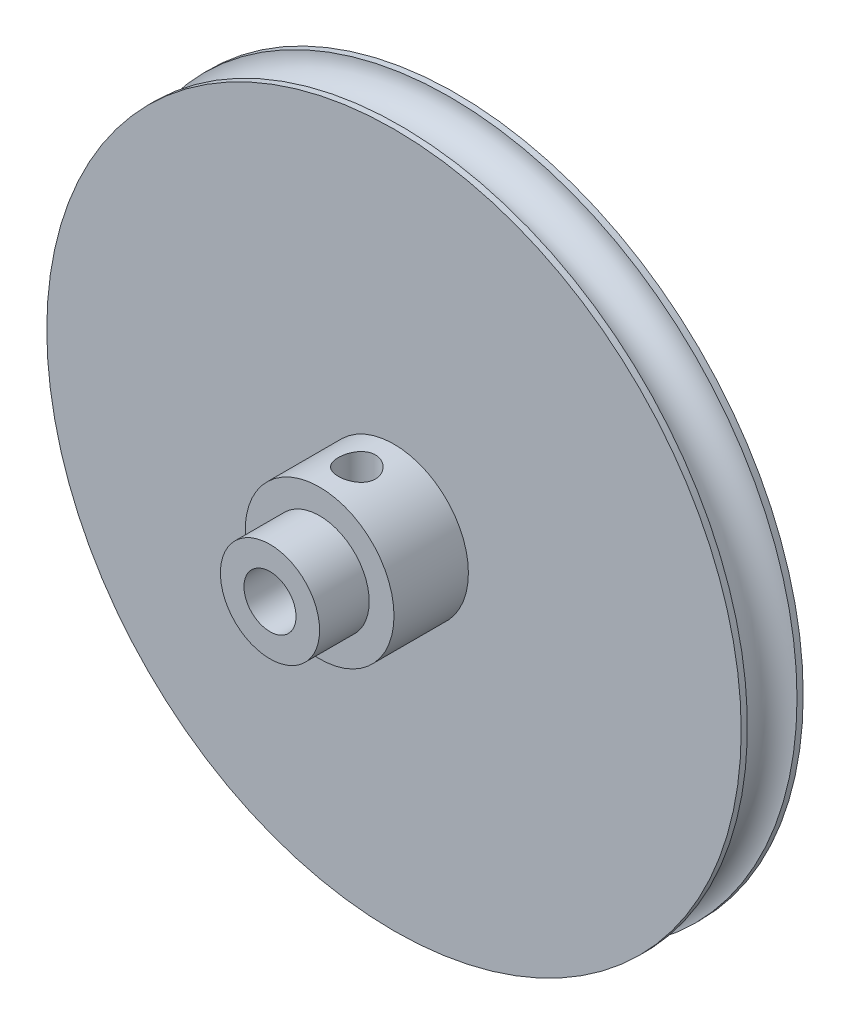
ISO-10303-21;
HEADER;
FILE_DESCRIPTION(('STEP AP214'),'2;1');
FILE_NAME('part.step','',(''),(''),'','','');
FILE_SCHEMA(('AUTOMOTIVE_DESIGN { 1 0 10303 214 1 1 1 1 }'));
ENDSEC;
DATA;
#1=APPLICATION_CONTEXT('core data for automotive mechanical design processes');
#2=APPLICATION_PROTOCOL_DEFINITION('international standard','automotive_design',2000,#1);
#3=PRODUCT_CONTEXT('',#1,'mechanical');
#4=PRODUCT('Part','Part','',(#3));
#5=PRODUCT_RELATED_PRODUCT_CATEGORY('part','',(#4));
#6=PRODUCT_DEFINITION_FORMATION('','',#4);
#7=PRODUCT_DEFINITION_CONTEXT('part definition',#1,'design');
#8=PRODUCT_DEFINITION('design','',#6,#7);
#9=PRODUCT_DEFINITION_SHAPE('','',#8);
#10=(LENGTH_UNIT() NAMED_UNIT(*) SI_UNIT(.MILLI.,.METRE.));
#11=(NAMED_UNIT(*) PLANE_ANGLE_UNIT() SI_UNIT($,.RADIAN.));
#12=(NAMED_UNIT(*) SI_UNIT($,.STERADIAN.) SOLID_ANGLE_UNIT());
#13=UNCERTAINTY_MEASURE_WITH_UNIT(LENGTH_MEASURE(1.E-05),#10,'distance_accuracy_value','');
#14=(GEOMETRIC_REPRESENTATION_CONTEXT(3) GLOBAL_UNCERTAINTY_ASSIGNED_CONTEXT((#13)) GLOBAL_UNIT_ASSIGNED_CONTEXT((#10,
#11,#12)) REPRESENTATION_CONTEXT('',''));
#15=CARTESIAN_POINT('',(0.,0.,0.));
#16=DIRECTION('',(0.,0.,1.));
#17=DIRECTION('',(1.,0.,0.));
#18=AXIS2_PLACEMENT_3D('',#15,#16,#17);
#19=CARTESIAN_POINT('',(0.,0.,0.));
#20=DIRECTION('',(0.,0.,1.));
#21=DIRECTION('',(1.,0.,0.));
#22=AXIS2_PLACEMENT_3D('',#19,#20,#21);
#23=CYLINDRICAL_SURFACE('',#22,2.1);
#24=CARTESIAN_POINT('',(0.,0.,0.));
#25=DIRECTION('',(0.,0.,1.));
#26=DIRECTION('',(1.,0.,0.));
#27=AXIS2_PLACEMENT_3D('',#24,#25,#26);
#28=CIRCLE('',#27,2.1);
#29=CARTESIAN_POINT('',(2.1,0.,0.));
#30=VERTEX_POINT('',#29);
#31=EDGE_CURVE('E72',#30,#30,#28,.T.);
#32=ORIENTED_EDGE('',*,*,#31,.F.);
#33=EDGE_LOOP('',(#32));
#34=FACE_BOUND('',#33,.T.);
#35=CARTESIAN_POINT('',(0.,0.,15.));
#36=DIRECTION('',(0.,0.,1.));
#37=DIRECTION('',(1.,0.,0.));
#38=AXIS2_PLACEMENT_3D('',#35,#36,#37);
#39=CIRCLE('',#38,2.1);
#40=CARTESIAN_POINT('',(2.1,0.,15.));
#41=VERTEX_POINT('',#40);
#42=EDGE_CURVE('E60',#41,#41,#39,.T.);
#43=ORIENTED_EDGE('',*,*,#42,.T.);
#44=EDGE_LOOP('',(#43));
#45=FACE_BOUND('',#44,.T.);
#46=CARTESIAN_POINT('',(0.,2.1,6.5));
#47=CARTESIAN_POINT('',(-0.0742399871543133,2.10000151369632,6.4999983328154));
#48=CARTESIAN_POINT('',(-0.148472287801961,2.0960305657222,6.50554237877936));
#49=CARTESIAN_POINT('',(-0.294537510569104,2.08054007579461,6.52734752510382));
#50=CARTESIAN_POINT('',(-0.366369374426851,2.06901724946753,6.54361328844457));
#51=CARTESIAN_POINT('',(-0.50528075991223,2.03953798236433,6.58580730876702));
#52=CARTESIAN_POINT('',(-0.572382093189152,2.02161374748366,6.61168722208121));
#53=CARTESIAN_POINT('',(-0.700940346431812,1.98071681938224,6.67194572495396));
#54=CARTESIAN_POINT('',(-0.762396508800773,1.95774344995381,6.70632545293122));
#55=CARTESIAN_POINT('',(-0.884158454498676,1.90604858079968,6.78590735169895));
#56=CARTESIAN_POINT('',(-0.943867292555756,1.87699641663021,6.83180339564521));
#57=CARTESIAN_POINT('',(-1.05527082397682,1.81670725523487,6.93135802863467));
#58=CARTESIAN_POINT('',(-1.10695327031243,1.78546702271467,6.98502824333768));
#59=CARTESIAN_POINT('',(-1.21060137903401,1.71725277223226,7.10994386142664));
#60=CARTESIAN_POINT('',(-1.26087106387615,1.6802808930462,7.18260623445379));
#61=CARTESIAN_POINT('',(-1.34855873776776,1.61074875287382,7.33723290190451));
#62=CARTESIAN_POINT('',(-1.38599721054951,1.57818151113002,7.41918208989052));
#63=CARTESIAN_POINT('',(-1.43652136520738,1.53205163132706,7.56383551655094));
#64=CARTESIAN_POINT('',(-1.45356662497443,1.51574445703128,7.62427010011254));
#65=CARTESIAN_POINT('',(-1.48005230154604,1.48989690052004,7.74813125986272));
#66=CARTESIAN_POINT('',(-1.48950884665266,1.48034217251357,7.81155118576373));
#67=CARTESIAN_POINT('',(-1.50020552985074,1.46950664613977,7.94023918165237));
#68=CARTESIAN_POINT('',(-1.50139229875544,1.4682795919234,8.00551653126422));
#69=CARTESIAN_POINT('',(-1.49530198035969,1.47447819447096,8.13527910247194));
#70=CARTESIAN_POINT('',(-1.48801790144054,1.48191099886764,8.19976362526865));
#71=CARTESIAN_POINT('',(-1.46411936401694,1.50554403866107,8.33404743418658));
#72=CARTESIAN_POINT('',(-1.44643072329694,1.52274402363615,8.40347164030273));
#73=CARTESIAN_POINT('',(-1.4021917385744,1.56357256020827,8.53745883716731));
#74=CARTESIAN_POINT('',(-1.37562175610307,1.58721533654268,8.60201066286822));
#75=CARTESIAN_POINT('',(-1.30511742817236,1.64601588118791,8.74487359971785));
#76=CARTESIAN_POINT('',(-1.25835357558366,1.68247147274397,8.82124871944658));
#77=CARTESIAN_POINT('',(-1.15248477752396,1.7566939000375,8.96420876920869));
#78=CARTESIAN_POINT('',(-1.09336770173586,1.79446199397487,9.03078396580656));
#79=CARTESIAN_POINT('',(-0.962800834327988,1.86780118446223,9.15374610256342));
#80=CARTESIAN_POINT('',(-0.891235370375022,1.90334699446249,9.21002630038693));
#81=CARTESIAN_POINT('',(-0.737122627440592,1.96814501690765,9.30958684669262));
#82=CARTESIAN_POINT('',(-0.65460111567732,1.99741158728469,9.35289694404326));
#83=CARTESIAN_POINT('',(-0.502786762492051,2.04003552659874,9.41495911411483));
#84=CARTESIAN_POINT('',(-0.435502933372758,2.05554723038274,9.43715862830042));
#85=CARTESIAN_POINT('',(-0.297347607907103,2.08002166700399,9.47195293731333));
#86=CARTESIAN_POINT('',(-0.226478758682595,2.08898915863501,9.48455471167792));
#87=CARTESIAN_POINT('',(-0.0828808130577211,2.09960209594909,9.49945210799232));
#88=CARTESIAN_POINT('',(-0.010146545777712,2.10122431355105,9.5017150354395));
#89=CARTESIAN_POINT('',(0.134662144507586,2.09692955045279,9.49569982836806));
#90=CARTESIAN_POINT('',(0.206736496598428,2.09101176886314,9.48742057407193));
#91=CARTESIAN_POINT('',(0.344652982451688,2.07263811534357,9.46147425615718));
#92=CARTESIAN_POINT('',(0.410628443822306,2.06050712104557,9.44427317826975));
#93=CARTESIAN_POINT('',(0.538540725972052,2.03083469907945,9.40161471286659));
#94=CARTESIAN_POINT('',(0.600476724637227,2.01329217419011,9.37615565093967));
#95=CARTESIAN_POINT('',(0.724729922862119,1.97216386451729,9.31528707061168));
#96=CARTESIAN_POINT('',(0.786570692260156,1.94817387755705,9.27918375398114));
#97=CARTESIAN_POINT('',(0.903575664869076,1.89674553679489,9.19940562360568));
#98=CARTESIAN_POINT('',(0.958734635088284,1.86930451408402,9.15572493976613));
#99=CARTESIAN_POINT('',(1.07130953790489,1.80751918651238,9.05313947500197));
#100=CARTESIAN_POINT('',(1.12732700599567,1.7728243678149,8.99291015245525));
#101=CARTESIAN_POINT('',(1.22898063188699,1.7039290476612,8.86391895127193));
#102=CARTESIAN_POINT('',(1.27461125255647,1.66972881892082,8.79515255164361));
#103=CARTESIAN_POINT('',(1.34840655881998,1.61049068369465,8.66085026071817));
#104=CARTESIAN_POINT('',(1.3781826574188,1.58485448207674,8.59646831298758));
#105=CARTESIAN_POINT('',(1.42875227353067,1.5394240379246,8.4623595209991));
#106=CARTESIAN_POINT('',(1.44956479313556,1.51961746555234,8.39264435618441));
#107=CARTESIAN_POINT('',(1.4780823346379,1.49184341447738,8.26239071370563));
#108=CARTESIAN_POINT('',(1.48750670349303,1.4823579407629,8.20256156443556));
#109=CARTESIAN_POINT('',(1.49901279618901,1.47072540809102,8.08151817591817));
#110=CARTESIAN_POINT('',(1.50110270525938,1.46857016870271,8.02030555748));
#111=CARTESIAN_POINT('',(1.49779304937287,1.47194411498406,7.89830492771636));
#112=CARTESIAN_POINT('',(1.49239297729272,1.47747382097746,7.83751694542176));
#113=CARTESIAN_POINT('',(1.47449551867843,1.49533169466967,7.71799156146261));
#114=CARTESIAN_POINT('',(1.46198715244103,1.50767037888344,7.65925748166074));
#115=CARTESIAN_POINT('',(1.42521014636684,1.54259872476081,7.52557578610495));
#116=CARTESIAN_POINT('',(1.39839283351164,1.56724515694173,7.45187734889083));
#117=CARTESIAN_POINT('',(1.33469997861311,1.62183051991132,7.31110860328652));
#118=CARTESIAN_POINT('',(1.2978077170184,1.65177821892023,7.24404956740886));
#119=CARTESIAN_POINT('',(1.21375615645452,1.71453266330322,7.11520341191946));
#120=CARTESIAN_POINT('',(1.1663473765118,1.74739464555719,7.05360662423695));
#121=CARTESIAN_POINT('',(1.06240230609338,1.81247541609043,6.93824127673773));
#122=CARTESIAN_POINT('',(1.00586287927557,1.84469397906931,6.88447541892804));
#123=CARTESIAN_POINT('',(0.873603136327678,1.91133354237187,6.77719467466611));
#124=CARTESIAN_POINT('',(0.796256196228739,1.94518702963912,6.72529915603061));
#125=CARTESIAN_POINT('',(0.630875696670564,2.00491356473176,6.63589529742952));
#126=CARTESIAN_POINT('',(0.542860755389261,2.03080024477001,6.59836235418693));
#127=CARTESIAN_POINT('',(0.379081513008418,2.06681366995399,6.54673596947778));
#128=CARTESIAN_POINT('',(0.304852347827538,2.07914974133551,6.52931026283795));
#129=CARTESIAN_POINT('',(0.153744270008504,2.09573818287287,6.50594874121106));
#130=CARTESIAN_POINT('',(0.0768680148396465,2.09999843272021,6.50000172620141));
#131=CARTESIAN_POINT('',(0.,2.1,6.5));
#132=B_SPLINE_CURVE_WITH_KNOTS('',3,(#46,#47,#48,#49,#50,#51,#52,#53,#54,#55,#56,#57,#58,#59,
#60,#61,#62,#63,#64,#65,#66,#67,#68,#69,#70,#71,#72,#73,#74,#75,#76,#77,#78,#79,#80,#81,#82,#83,
#84,#85,#86,#87,#88,#89,#90,#91,#92,#93,#94,#95,#96,#97,#98,#99,#100,#101,#102,#103,#104,#105,
#106,#107,#108,#109,#110,#111,#112,#113,#114,#115,#116,#117,#118,#119,#120,#121,#122,#123,#124,
#125,#126,#127,#128,#129,#130,#131),.UNSPECIFIED.,.T.,.F.,(4,2,2,2,2,2,2,2,2,2,2,2,2,2,2,2,2,2,
2,2,2,2,2,2,2,2,2,2,2,2,2,2,2,2,2,2,2,2,2,2,2,2,4),(0.,0.222407137033423,0.444911064992703,
0.666310976308092,0.887740556796045,1.12901917175521,1.37066239795699,1.65674641323183,
1.94237157348726,2.13628403403777,2.32978327261917,2.52453011590944,2.71943781235789,
2.93927374942446,3.15959904043209,3.4482078819463,3.73710146762559,4.02883886432737,
4.31990190033579,4.53657909767286,4.7530985751299,4.97030227966831,5.18752905724044,
5.39440800172806,5.60132891979957,5.82704593329478,6.05293859435066,6.31971670046752,
6.58663669215808,6.81214633204463,7.03717552727382,7.22029125711348,7.40320256538924,
7.58612625862381,7.76933327276093,8.01461476402193,8.2603058040042,8.51260573354359,
8.76499251219979,9.06059540426992,9.35568963348344,9.58619480297342,9.81647494936398),.UNSPECIFIED.);
#133=CARTESIAN_POINT('',(0.,2.1,6.5));
#134=VERTEX_POINT('',#133);
#135=EDGE_CURVE('E129',#134,#134,#132,.T.);
#136=ORIENTED_EDGE('',*,*,#135,.T.);
#137=EDGE_LOOP('',(#136));
#138=FACE_BOUND('',#137,.T.);
#139=ADVANCED_FACE('F37',(#34,#45,#138),#23,.F.);
#140=CARTESIAN_POINT('',(0.,0.,11.));
#141=DIRECTION('',(0.,0.,-1.));
#142=DIRECTION('',(-1.,0.,0.));
#143=AXIS2_PLACEMENT_3D('',#140,#141,#142);
#144=CYLINDRICAL_SURFACE('',#143,6.);
#145=CARTESIAN_POINT('',(0.,0.,11.));
#146=DIRECTION('',(0.,0.,1.));
#147=DIRECTION('',(1.,0.,0.));
#148=AXIS2_PLACEMENT_3D('',#145,#146,#147);
#149=CIRCLE('',#148,6.);
#150=CARTESIAN_POINT('',(6.,0.,11.));
#151=VERTEX_POINT('',#150);
#152=EDGE_CURVE('E56',#151,#151,#149,.T.);
#153=ORIENTED_EDGE('',*,*,#152,.F.);
#154=EDGE_LOOP('',(#153));
#155=FACE_BOUND('',#154,.T.);
#156=CARTESIAN_POINT('',(0.,0.,5.));
#157=DIRECTION('',(0.,0.,1.));
#158=DIRECTION('',(1.,0.,0.));
#159=AXIS2_PLACEMENT_3D('',#156,#157,#158);
#160=CIRCLE('',#159,6.);
#161=CARTESIAN_POINT('',(6.,0.,5.));
#162=VERTEX_POINT('',#161);
#163=EDGE_CURVE('E62',#162,#162,#160,.T.);
#164=ORIENTED_EDGE('',*,*,#163,.T.);
#165=EDGE_LOOP('',(#164));
#166=FACE_BOUND('',#165,.T.);
#167=CARTESIAN_POINT('',(0.,6.,6.5));
#168=CARTESIAN_POINT('',(0.0828760886697303,5.99999859868013,6.50000232573816));
#169=CARTESIAN_POINT('',(0.165778157830762,5.99826578131828,6.50689155077379));
#170=CARTESIAN_POINT('',(0.329206323770532,5.99152113829892,6.534225151307));
#171=CARTESIAN_POINT('',(0.409731046870738,5.98650745419968,6.55467720953785));
#172=CARTESIAN_POINT('',(0.566020872182576,5.9737562633204,6.60843925346209));
#173=CARTESIAN_POINT('',(0.641791563430002,5.96602202842087,6.64173379871528));
#174=CARTESIAN_POINT('',(0.786672131904426,5.94865343807593,6.72018139004483));
#175=CARTESIAN_POINT('',(0.855781784348759,5.9390190185405,6.76533483611894));
#176=CARTESIAN_POINT('',(0.986801927300919,5.91867413591801,6.86720078965421));
#177=CARTESIAN_POINT('',(1.04855569006107,5.90794707148533,6.92411157495918));
#178=CARTESIAN_POINT('',(1.1617489272033,5.8867362011753,7.04745220490892));
#179=CARTESIAN_POINT('',(1.21318723694913,5.87625242288348,7.1138831229465));
#180=CARTESIAN_POINT('',(1.30502654279903,5.8565477569971,7.25559522673744));
#181=CARTESIAN_POINT('',(1.34525221592536,5.84734794470605,7.3309932308104));
#182=CARTESIAN_POINT('',(1.41239690855053,5.83149494812223,7.48774841165836));
#183=CARTESIAN_POINT('',(1.43931805543933,5.82484135672789,7.56910463332576));
#184=CARTESIAN_POINT('',(1.47855483680429,5.81500476717551,7.73374349820248));
#185=CARTESIAN_POINT('',(1.49115226833334,5.81175491075426,7.8169548960498));
#186=CARTESIAN_POINT('',(1.50226177506785,5.80889362537741,7.98436856901398));
#187=CARTESIAN_POINT('',(1.50077614181798,5.80928160448644,8.06857068069861));
#188=CARTESIAN_POINT('',(1.48398652463928,5.81359205496618,8.23341580774448));
#189=CARTESIAN_POINT('',(1.46901834019052,5.81742863001879,8.3140956214651));
#190=CARTESIAN_POINT('',(1.42622418690311,5.82806709676484,8.47176105091129));
#191=CARTESIAN_POINT('',(1.39839730206942,5.83486919970697,8.54874640302898));
#192=CARTESIAN_POINT('',(1.33038947793715,5.85075113904187,8.69773801625207));
#193=CARTESIAN_POINT('',(1.29008666723291,5.85985327469421,8.76968617178955));
#194=CARTESIAN_POINT('',(1.19835627601495,5.87929710846386,8.90591870975684));
#195=CARTESIAN_POINT('',(1.14692674880884,5.88963902334735,8.97020174806726));
#196=CARTESIAN_POINT('',(1.03266342468122,5.91075880539781,9.0912036156944));
#197=CARTESIAN_POINT('',(0.969546258165858,5.92154069477971,9.14765449006135));
#198=CARTESIAN_POINT('',(0.834611917503698,5.94205965578786,9.24922124246391));
#199=CARTESIAN_POINT('',(0.762794477707942,5.95179669549415,9.29433677426357));
#200=CARTESIAN_POINT('',(0.61211588868139,5.96917732094183,9.37205058622439));
#201=CARTESIAN_POINT('',(0.533231393208622,5.97681360127725,9.40460534025443));
#202=CARTESIAN_POINT('',(0.370876008142881,5.98907916991419,9.45591730570957));
#203=CARTESIAN_POINT('',(0.287405999150483,5.99370903339281,9.47467715641814));
#204=CARTESIAN_POINT('',(0.120539970390025,5.99935499271375,9.49745756555884));
#205=CARTESIAN_POINT('',(0.0371967199882081,6.00046053508279,9.5018430260753));
#206=CARTESIAN_POINT('',(-0.12903287480151,5.99918804814451,9.49675099794451));
#207=CARTESIAN_POINT('',(-0.211919259644597,5.99681033241847,9.48727475720087));
#208=CARTESIAN_POINT('',(-0.373614268776494,5.98889581127357,9.45502909160862));
#209=CARTESIAN_POINT('',(-0.452465118968757,5.98340634185811,9.43245873652301));
#210=CARTESIAN_POINT('',(-0.605257292452514,5.96988706634134,9.37489291597155));
#211=CARTESIAN_POINT('',(-0.679198119032637,5.96185700369892,9.33989619568683));
#212=CARTESIAN_POINT('',(-0.821523134429849,5.9439330792631,9.25776387112527));
#213=CARTESIAN_POINT('',(-0.889785441835833,5.93400867366932,9.21042388760324));
#214=CARTESIAN_POINT('',(-1.01752661364325,5.91344509187419,9.10521009120303));
#215=CARTESIAN_POINT('',(-1.07700395897301,5.90280579251705,9.04733446038309));
#216=CARTESIAN_POINT('',(-1.18699056807273,5.88168956960771,8.92099803915554));
#217=CARTESIAN_POINT('',(-1.23724386762203,5.87122304187281,8.85231229699758));
#218=CARTESIAN_POINT('',(-1.3255107590127,5.85192878377239,8.70726736553428));
#219=CARTESIAN_POINT('',(-1.36352489415794,5.84310098067026,8.63090851704025));
#220=CARTESIAN_POINT('',(-1.42595142060929,5.82818094734665,8.47309427758692));
#221=CARTESIAN_POINT('',(-1.45044439665407,5.82207255291905,8.39167237165599));
#222=CARTESIAN_POINT('',(-1.48534565995378,5.81326744090183,8.22569036211089));
#223=CARTESIAN_POINT('',(-1.49575702747866,5.81056997719936,8.14113094896751));
#224=CARTESIAN_POINT('',(-1.502038590334,5.80894901203957,7.9738789761448));
#225=CARTESIAN_POINT('',(-1.49831789778012,5.80991932728264,7.89120256487527));
#226=CARTESIAN_POINT('',(-1.47737727831287,5.81527909007843,7.72769611133202));
#227=CARTESIAN_POINT('',(-1.46015762268677,5.81966846891857,7.64686603198635));
#228=CARTESIAN_POINT('',(-1.4129313194428,5.83131260682723,7.48979154093459));
#229=CARTESIAN_POINT('',(-1.38300140468038,5.8385501523631,7.41352269475979));
#230=CARTESIAN_POINT('',(-1.31126491360507,5.85507755724829,7.26703461728631));
#231=CARTESIAN_POINT('',(-1.26945669003419,5.86436770120773,7.19681622681308));
#232=CARTESIAN_POINT('',(-1.17386774863714,5.88425634263512,7.06244537099798));
#233=CARTESIAN_POINT('',(-1.11980316291226,5.89488264831757,6.99849892657604));
#234=CARTESIAN_POINT('',(-1.00178937118974,5.91608027246286,6.88045295520459));
#235=CARTESIAN_POINT('',(-0.937837821261147,5.9266515772706,6.82635576988703));
#236=CARTESIAN_POINT('',(-0.800467586702591,5.94677655647663,6.72858869143539));
#237=CARTESIAN_POINT('',(-0.726898422316388,5.95630833365868,6.68512538632842));
#238=CARTESIAN_POINT('',(-0.573266059510477,5.97304924975118,6.61125253705947));
#239=CARTESIAN_POINT('',(-0.49320756343674,5.98026005199781,6.58083363935146));
#240=CARTESIAN_POINT('',(-0.344410253243472,5.99048059565542,6.53842816967035));
#241=CARTESIAN_POINT('',(-0.276380170908069,5.99402585052691,6.52404875694657));
#242=CARTESIAN_POINT('',(-0.138906071536284,5.99878605231948,6.50483405637806));
#243=CARTESIAN_POINT('',(-0.0694621612426172,6.00000117450894,6.4999980506947));
#244=CARTESIAN_POINT('',(0.,6.,6.5));
#245=B_SPLINE_CURVE_WITH_KNOTS('',3,(#167,#168,#169,#170,#171,#172,#173,#174,#175,#176,#177,
#178,#179,#180,#181,#182,#183,#184,#185,#186,#187,#188,#189,#190,#191,#192,#193,#194,#195,#196,
#197,#198,#199,#200,#201,#202,#203,#204,#205,#206,#207,#208,#209,#210,#211,#212,#213,#214,#215,
#216,#217,#218,#219,#220,#221,#222,#223,#224,#225,#226,#227,#228,#229,#230,#231,#232,#233,#234,
#235,#236,#237,#238,#239,#240,#241,#242,#243,#244),.UNSPECIFIED.,.T.,.F.,(4,2,2,2,2,2,2,2,2,2,2,
2,2,2,2,2,2,2,2,2,2,2,2,2,2,2,2,2,2,2,2,2,2,2,2,2,2,2,4),(0.,0.24837371247189,0.4968882377639,
0.745104902286106,0.993329940169328,1.24614435437139,1.49898729580062,1.75558647545807,
2.01214461169368,2.2635629509943,2.51494038112697,2.76022497007018,3.00552703466038,
3.25330527873879,3.50112690836163,3.75601500969019,4.01091089558247,4.26668229009114,
4.52240473688643,4.77158308949276,5.02073901112743,5.26620274514037,5.51169127322291,
5.76153587565352,6.01142363008019,6.26744509204476,6.52345518749508,6.77792254614036,
7.03233423252408,7.27943780398613,7.52653640956034,7.77216400559447,8.01782568136901,
8.2698957640991,8.52202569770417,8.77872185499588,9.0352336382135,9.24342242942149,
9.45159556043039),.UNSPECIFIED.);
#246=CARTESIAN_POINT('',(0.,6.,6.5));
#247=VERTEX_POINT('',#246);
#248=EDGE_CURVE('E125',#247,#247,#245,.T.);
#249=ORIENTED_EDGE('',*,*,#248,.T.);
#250=EDGE_LOOP('',(#249));
#251=FACE_BOUND('',#250,.T.);
#252=ADVANCED_FACE('F99',(#155,#166,#251),#144,.T.);
#253=CARTESIAN_POINT('',(0.,0.,5.));
#254=DIRECTION('',(0.,0.,1.));
#255=DIRECTION('',(1.,0.,0.));
#256=AXIS2_PLACEMENT_3D('',#253,#254,#255);
#257=PLANE('',#256);
#258=CARTESIAN_POINT('',(0.,0.,5.));
#259=DIRECTION('',(0.,0.,1.));
#260=DIRECTION('',(1.,0.,0.));
#261=AXIS2_PLACEMENT_3D('',#258,#259,#260);
#262=CIRCLE('',#261,28.);
#263=CARTESIAN_POINT('',(28.,0.,5.));
#264=VERTEX_POINT('',#263);
#265=EDGE_CURVE('E10',#264,#264,#262,.T.);
#266=ORIENTED_EDGE('',*,*,#265,.T.);
#267=EDGE_LOOP('',(#266));
#268=FACE_BOUND('',#267,.T.);
#269=ORIENTED_EDGE('',*,*,#163,.F.);
#270=EDGE_LOOP('',(#269));
#271=FACE_BOUND('',#270,.T.);
#272=ADVANCED_FACE('F105',(#268,#271),#257,.T.);
#273=CARTESIAN_POINT('',(0.,0.,5.));
#274=DIRECTION('',(0.,0.,-1.));
#275=DIRECTION('',(-1.,0.,0.));
#276=AXIS2_PLACEMENT_3D('',#273,#274,#275);
#277=CYLINDRICAL_SURFACE('',#276,28.);
#278=CARTESIAN_POINT('',(0.,0.,0.5));
#279=DIRECTION('',(0.,0.,1.));
#280=DIRECTION('',(1.,0.,0.));
#281=AXIS2_PLACEMENT_3D('',#278,#279,#280);
#282=CIRCLE('',#281,28.);
#283=CARTESIAN_POINT('',(28.,0.,0.5));
#284=VERTEX_POINT('',#283);
#285=EDGE_CURVE('E41',#284,#284,#282,.F.);
#286=ORIENTED_EDGE('',*,*,#285,.T.);
#287=EDGE_LOOP('',(#286));
#288=FACE_BOUND('',#287,.T.);
#289=CARTESIAN_POINT('',(0.,0.,0.));
#290=DIRECTION('',(0.,0.,1.));
#291=DIRECTION('',(1.,0.,0.));
#292=AXIS2_PLACEMENT_3D('',#289,#290,#291);
#293=CIRCLE('',#292,28.);
#294=CARTESIAN_POINT('',(28.,0.,0.));
#295=VERTEX_POINT('',#294);
#296=EDGE_CURVE('E45',#295,#295,#293,.T.);
#297=ORIENTED_EDGE('',*,*,#296,.T.);
#298=EDGE_LOOP('',(#297));
#299=FACE_BOUND('',#298,.T.);
#300=ADVANCED_FACE('F169',(#288,#299),#277,.T.);
#301=CARTESIAN_POINT('',(0.,0.,4.5));
#302=DIRECTION('',(0.,0.,-1.));
#303=DIRECTION('',(-1.,0.,0.));
#304=AXIS2_PLACEMENT_3D('',#301,#302,#303);
#305=CIRCLE('',#304,28.);
#306=CARTESIAN_POINT('',(-28.,0.,4.5));
#307=VERTEX_POINT('',#306);
#308=EDGE_CURVE('E54',#307,#307,#305,.F.);
#309=ORIENTED_EDGE('',*,*,#308,.T.);
#310=EDGE_LOOP('',(#309));
#311=FACE_BOUND('',#310,.T.);
#312=ORIENTED_EDGE('',*,*,#265,.F.);
#313=EDGE_LOOP('',(#312));
#314=FACE_BOUND('',#313,.T.);
#315=ADVANCED_FACE('F39',(#311,#314),#277,.T.);
#316=CARTESIAN_POINT('',(0.,0.,0.));
#317=DIRECTION('',(0.,0.,1.));
#318=DIRECTION('',(1.,0.,0.));
#319=AXIS2_PLACEMENT_3D('',#316,#317,#318);
#320=PLANE('',#319);
#321=ORIENTED_EDGE('',*,*,#31,.T.);
#322=EDGE_LOOP('',(#321));
#323=FACE_BOUND('',#322,.T.);
#324=ORIENTED_EDGE('',*,*,#296,.F.);
#325=EDGE_LOOP('',(#324));
#326=FACE_BOUND('',#325,.T.);
#327=ADVANCED_FACE('F89',(#323,#326),#320,.F.);
#328=CARTESIAN_POINT('',(0.,0.,15.));
#329=DIRECTION('',(0.,0.,-1.));
#330=DIRECTION('',(-1.,0.,0.));
#331=AXIS2_PLACEMENT_3D('',#328,#329,#330);
#332=CYLINDRICAL_SURFACE('',#331,4.);
#333=CARTESIAN_POINT('',(0.,0.,11.));
#334=DIRECTION('',(0.,0.,1.));
#335=DIRECTION('',(1.,0.,0.));
#336=AXIS2_PLACEMENT_3D('',#333,#334,#335);
#337=CIRCLE('',#336,4.);
#338=CARTESIAN_POINT('',(4.,0.,11.));
#339=VERTEX_POINT('',#338);
#340=EDGE_CURVE('E67',#339,#339,#337,.T.);
#341=ORIENTED_EDGE('',*,*,#340,.T.);
#342=EDGE_LOOP('',(#341));
#343=FACE_BOUND('',#342,.T.);
#344=CARTESIAN_POINT('',(0.,0.,15.));
#345=DIRECTION('',(0.,0.,1.));
#346=DIRECTION('',(1.,0.,0.));
#347=AXIS2_PLACEMENT_3D('',#344,#345,#346);
#348=CIRCLE('',#347,4.);
#349=CARTESIAN_POINT('',(4.,0.,15.));
#350=VERTEX_POINT('',#349);
#351=EDGE_CURVE('E50',#350,#350,#348,.T.);
#352=ORIENTED_EDGE('',*,*,#351,.F.);
#353=EDGE_LOOP('',(#352));
#354=FACE_BOUND('',#353,.T.);
#355=ADVANCED_FACE('F83',(#343,#354),#332,.T.);
#356=CARTESIAN_POINT('',(0.,0.,15.));
#357=DIRECTION('',(0.,0.,1.));
#358=DIRECTION('',(1.,0.,0.));
#359=AXIS2_PLACEMENT_3D('',#356,#357,#358);
#360=PLANE('',#359);
#361=ORIENTED_EDGE('',*,*,#42,.F.);
#362=EDGE_LOOP('',(#361));
#363=FACE_BOUND('',#362,.T.);
#364=ORIENTED_EDGE('',*,*,#351,.T.);
#365=EDGE_LOOP('',(#364));
#366=FACE_BOUND('',#365,.T.);
#367=ADVANCED_FACE('F79',(#363,#366),#360,.T.);
#368=CARTESIAN_POINT('',(0.,0.,2.5));
#369=DIRECTION('',(0.,0.,-1.));
#370=DIRECTION('',(-1.,0.,0.));
#371=AXIS2_PLACEMENT_3D('',#368,#369,#370);
#372=TOROIDAL_SURFACE('',#371,28.,2.);
#373=ORIENTED_EDGE('',*,*,#308,.F.);
#374=EDGE_LOOP('',(#373));
#375=FACE_BOUND('',#374,.T.);
#376=ORIENTED_EDGE('',*,*,#285,.F.);
#377=EDGE_LOOP('',(#376));
#378=FACE_BOUND('',#377,.T.);
#379=ADVANCED_FACE('F82',(#375,#378),#372,.F.);
#380=CARTESIAN_POINT('',(0.,0.,11.));
#381=DIRECTION('',(0.,0.,1.));
#382=DIRECTION('',(1.,0.,0.));
#383=AXIS2_PLACEMENT_3D('',#380,#381,#382);
#384=PLANE('',#383);
#385=ORIENTED_EDGE('',*,*,#152,.T.);
#386=EDGE_LOOP('',(#385));
#387=FACE_BOUND('',#386,.T.);
#388=ORIENTED_EDGE('',*,*,#340,.F.);
#389=EDGE_LOOP('',(#388));
#390=FACE_BOUND('',#389,.T.);
#391=ADVANCED_FACE('F111',(#387,#390),#384,.T.);
#392=CARTESIAN_POINT('',(0.,28.001,8.));
#393=DIRECTION('',(0.,-1.,0.));
#394=DIRECTION('',(0.,0.,-1.));
#395=AXIS2_PLACEMENT_3D('',#392,#393,#394);
#396=CYLINDRICAL_SURFACE('',#395,1.5);
#397=ORIENTED_EDGE('',*,*,#248,.F.);
#398=EDGE_LOOP('',(#397));
#399=FACE_BOUND('',#398,.T.);
#400=ORIENTED_EDGE('',*,*,#135,.F.);
#401=EDGE_LOOP('',(#400));
#402=FACE_BOUND('',#401,.T.);
#403=ADVANCED_FACE('F116',(#399,#402),#396,.F.);
#404=CLOSED_SHELL('',(#139,#252,#272,#300,#315,#327,#355,#367,#379,#391,#403));
#405=MANIFOLD_SOLID_BREP('B2',#404);
#406=ADVANCED_BREP_SHAPE_REPRESENTATION('',(#18,#405),#14);
#407=SHAPE_DEFINITION_REPRESENTATION(#9,#406);
ENDSEC;
END-ISO-10303-21;
